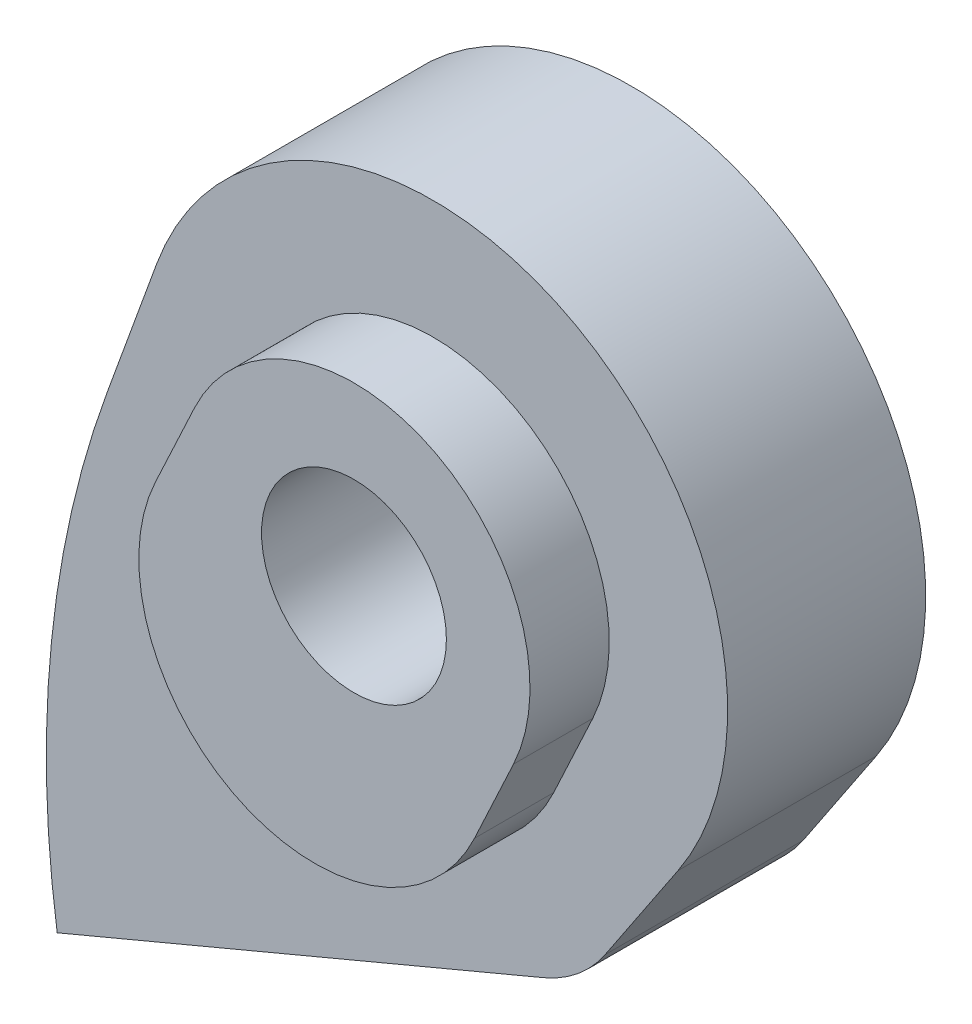
ISO-10303-21;
HEADER;
FILE_DESCRIPTION(('STEP AP214'),'2;1');
FILE_NAME('part.step','',(''),(''),'','','');
FILE_SCHEMA(('AUTOMOTIVE_DESIGN { 1 0 10303 214 1 1 1 1 }'));
ENDSEC;
DATA;
#1=APPLICATION_CONTEXT('core data for automotive mechanical design processes');
#2=APPLICATION_PROTOCOL_DEFINITION('international standard','automotive_design',2000,#1);
#3=PRODUCT_CONTEXT('',#1,'mechanical');
#4=PRODUCT('Part','Part','',(#3));
#5=PRODUCT_RELATED_PRODUCT_CATEGORY('part','',(#4));
#6=PRODUCT_DEFINITION_FORMATION('','',#4);
#7=PRODUCT_DEFINITION_CONTEXT('part definition',#1,'design');
#8=PRODUCT_DEFINITION('design','',#6,#7);
#9=PRODUCT_DEFINITION_SHAPE('','',#8);
#10=(LENGTH_UNIT() NAMED_UNIT(*) SI_UNIT(.MILLI.,.METRE.));
#11=(NAMED_UNIT(*) PLANE_ANGLE_UNIT() SI_UNIT($,.RADIAN.));
#12=(NAMED_UNIT(*) SI_UNIT($,.STERADIAN.) SOLID_ANGLE_UNIT());
#13=UNCERTAINTY_MEASURE_WITH_UNIT(LENGTH_MEASURE(1.E-05),#10,'distance_accuracy_value','');
#14=(GEOMETRIC_REPRESENTATION_CONTEXT(3) GLOBAL_UNCERTAINTY_ASSIGNED_CONTEXT((#13)) GLOBAL_UNIT_ASSIGNED_CONTEXT((#10,
#11,#12)) REPRESENTATION_CONTEXT('',''));
#15=CARTESIAN_POINT('',(0.,0.,0.));
#16=DIRECTION('',(0.,0.,1.));
#17=DIRECTION('',(1.,0.,0.));
#18=AXIS2_PLACEMENT_3D('',#15,#16,#17);
#19=CARTESIAN_POINT('',(0.11468761398859,80.1325343968941,0.));
#20=DIRECTION('',(0.,0.,1.));
#21=DIRECTION('',(1.,0.,0.));
#22=AXIS2_PLACEMENT_3D('',#19,#20,#21);
#23=PLANE('',#22);
#24=CARTESIAN_POINT('',(14.2795120747355,71.4970986035797,0.));
#25=DIRECTION('',(0.,0.,1.));
#26=DIRECTION('',(1.,0.,0.));
#27=AXIS2_PLACEMENT_3D('',#24,#25,#26);
#28=CIRCLE('',#27,22.9540740082007);
#29=CARTESIAN_POINT('',(-7.29026188774433,79.3478542857725,0.));
#30=VERTEX_POINT('',#29);
#31=CARTESIAN_POINT('',(-8.42769677737512,68.1396919078421,0.));
#32=VERTEX_POINT('',#31);
#33=EDGE_CURVE('E154',#30,#32,#28,.T.);
#34=ORIENTED_EDGE('',*,*,#33,.T.);
#35=DIRECTION('',(-0.921960246209325,-0.387284526426812,0.));
#36=VECTOR('',#35,1.);
#37=CARTESIAN_POINT('',(2.62584420432856,72.7829131335289,0.));
#38=LINE('',#37,#36);
#39=CARTESIAN_POINT('',(2.62584420432857,72.7829131335288,0.));
#40=VERTEX_POINT('',#39);
#41=EDGE_CURVE('E178',#40,#32,#38,.T.);
#42=ORIENTED_EDGE('',*,*,#41,.F.);
#43=CARTESIAN_POINT('',(1.41064938117233,75.6757767567832,0.));
#44=DIRECTION('',(0.,0.,-1.));
#45=DIRECTION('',(-1.,0.,0.));
#46=AXIS2_PLACEMENT_3D('',#43,#44,#45);
#47=CIRCLE('',#46,3.13773140994799);
#48=CARTESIAN_POINT('',(4.02035151590427,73.933705240183,0.));
#49=VERTEX_POINT('',#48);
#50=EDGE_CURVE('E173',#49,#40,#47,.T.);
#51=ORIENTED_EDGE('',*,*,#50,.F.);
#52=DIRECTION('',(0.555200968150768,0.831716228628761,0.));
#53=VECTOR('',#52,1.);
#54=CARTESIAN_POINT('',(4.02035151590429,73.933705240183,0.));
#55=LINE('',#54,#53);
#56=CARTESIAN_POINT('',(5.67886918351501,76.4182399199654,0.));
#57=VERTEX_POINT('',#56);
#58=EDGE_CURVE('E147',#49,#57,#55,.T.);
#59=ORIENTED_EDGE('',*,*,#58,.T.);
#60=CARTESIAN_POINT('',(0.11468761398859,80.1325343968941,0.));
#61=DIRECTION('',(0.,0.,1.));
#62=DIRECTION('',(1.,0.,0.));
#63=AXIS2_PLACEMENT_3D('',#60,#61,#62);
#64=CIRCLE('',#63,6.69000000000006);
#65=CARTESIAN_POINT('',(-6.17185601906935,82.4206491557424,0.));
#66=VERTEX_POINT('',#65);
#67=EDGE_CURVE('E149',#57,#66,#64,.T.);
#68=ORIENTED_EDGE('',*,*,#67,.T.);
#69=DIRECTION('',(-0.342020143325666,-0.939692620785909,0.));
#70=VECTOR('',#69,1.);
#71=CARTESIAN_POINT('',(-6.1718560190694,82.4206491557424,0.));
#72=LINE('',#71,#70);
#73=EDGE_CURVE('E155',#66,#30,#72,.T.);
#74=ORIENTED_EDGE('',*,*,#73,.T.);
#75=EDGE_LOOP('',(#34,#42,#51,#59,#68,#74));
#76=FACE_BOUND('',#75,.T.);
#77=DIRECTION('',(-0.4226182617407,-0.90630778703665,0.));
#78=VECTOR('',#77,1.);
#79=CARTESIAN_POINT('',(-3.51054353415801,81.8230074438569,0.));
#80=LINE('',#79,#78);
#81=CARTESIAN_POINT('',(-3.51054353415801,81.8230074438569,0.));
#82=VERTEX_POINT('',#81);
#83=CARTESIAN_POINT('',(-4.39804188381347,79.9197610910799,0.));
#84=VERTEX_POINT('',#83);
#85=EDGE_CURVE('E241',#82,#84,#80,.T.);
#86=ORIENTED_EDGE('',*,*,#85,.F.);
#87=CARTESIAN_POINT('',(0.114687613988609,80.1325343968941,0.));
#88=DIRECTION('',(0.,0.,1.));
#89=DIRECTION('',(1.,0.,0.));
#90=AXIS2_PLACEMENT_3D('',#87,#88,#89);
#91=CIRCLE('',#90,4.00000000000001);
#92=CARTESIAN_POINT('',(3.73991876213519,78.4420613499313,0.));
#93=VERTEX_POINT('',#92);
#94=EDGE_CURVE('E145',#93,#82,#91,.T.);
#95=ORIENTED_EDGE('',*,*,#94,.F.);
#96=DIRECTION('',(0.4226182617407,0.90630778703665,0.));
#97=VECTOR('',#96,1.);
#98=CARTESIAN_POINT('',(3.73991876213519,78.4420613499313,0.));
#99=LINE('',#98,#97);
#100=CARTESIAN_POINT('',(2.85242041247973,76.5388149971543,0.));
#101=VERTEX_POINT('',#100);
#102=EDGE_CURVE('E141',#101,#93,#99,.T.);
#103=ORIENTED_EDGE('',*,*,#102,.F.);
#104=CARTESIAN_POINT('',(-0.772810735666862,78.2292880441171,0.));
#105=DIRECTION('',(0.,0.,1.));
#106=DIRECTION('',(1.,0.,0.));
#107=AXIS2_PLACEMENT_3D('',#104,#105,#106);
#108=CIRCLE('',#107,4.00000000000001);
#109=EDGE_CURVE('E243',#84,#101,#108,.T.);
#110=ORIENTED_EDGE('',*,*,#109,.F.);
#111=EDGE_LOOP('',(#86,#95,#103,#110));
#112=FACE_BOUND('',#111,.T.);
#113=ADVANCED_FACE('F33',(#76,#112),#23,.T.);
#114=CARTESIAN_POINT('',(-8.01359795678153,76.9658058271043,-7.5));
#115=DIRECTION('',(-0.921960246209324,-0.387284526426815,0.));
#116=DIRECTION('',(0.387284526426815,-0.921960246209324,0.));
#117=AXIS2_PLACEMENT_3D('',#114,#115,#116);
#118=PLANE('',#117);
#119=DIRECTION('',(0.387284526426815,-0.921960246209324,0.));
#120=VECTOR('',#119,1.);
#121=CARTESIAN_POINT('',(-8.01359795678153,76.9658058271043,-4.5));
#122=LINE('',#121,#120);
#123=CARTESIAN_POINT('',(-8.01359795678153,76.9658058271043,-4.5));
#124=VERTEX_POINT('',#123);
#125=CARTESIAN_POINT('',(-4.92424784177968,69.611373108264,-4.5));
#126=VERTEX_POINT('',#125);
#127=EDGE_CURVE('E56',#124,#126,#122,.T.);
#128=ORIENTED_EDGE('',*,*,#127,.T.);
#129=DIRECTION('',(0.,0.,1.));
#130=VECTOR('',#129,1.);
#131=CARTESIAN_POINT('',(-4.92424784177968,69.611373108264,-7.5));
#132=LINE('',#131,#130);
#133=CARTESIAN_POINT('',(-4.92424784177968,69.611373108264,-7.5));
#134=VERTEX_POINT('',#133);
#135=EDGE_CURVE('E166',#134,#126,#132,.T.);
#136=ORIENTED_EDGE('',*,*,#135,.F.);
#137=DIRECTION('',(0.387284526426815,-0.921960246209324,0.));
#138=VECTOR('',#137,1.);
#139=CARTESIAN_POINT('',(-8.01359795678153,76.9658058271043,-7.5));
#140=LINE('',#139,#138);
#141=CARTESIAN_POINT('',(-8.01359795678153,76.9658058271043,-7.5));
#142=VERTEX_POINT('',#141);
#143=EDGE_CURVE('E164',#142,#134,#140,.T.);
#144=ORIENTED_EDGE('',*,*,#143,.F.);
#145=DIRECTION('',(0.,0.,1.));
#146=VECTOR('',#145,1.);
#147=CARTESIAN_POINT('',(-8.01359795678153,76.9658058271043,-7.5));
#148=LINE('',#147,#146);
#149=EDGE_CURVE('E170',#142,#124,#148,.T.);
#150=ORIENTED_EDGE('',*,*,#149,.T.);
#151=EDGE_LOOP('',(#128,#136,#144,#150));
#152=FACE_BOUND('',#151,.T.);
#153=ADVANCED_FACE('F230',(#152),#118,.F.);
#154=CARTESIAN_POINT('',(14.2795120747355,71.4970986035797,-7.5));
#155=DIRECTION('',(0.,0.,1.));
#156=DIRECTION('',(1.,0.,0.));
#157=AXIS2_PLACEMENT_3D('',#154,#155,#156);
#158=PLANE('',#157);
#159=DIRECTION('',(-0.921960246209326,-0.38728452642681,0.));
#160=VECTOR('',#159,1.);
#161=CARTESIAN_POINT('',(-4.92424784177968,69.611373108264,-7.5));
#162=LINE('',#161,#160);
#163=CARTESIAN_POINT('',(-8.42769677737511,68.1396919078421,-7.5));
#164=VERTEX_POINT('',#163);
#165=EDGE_CURVE('E159',#134,#164,#162,.T.);
#166=ORIENTED_EDGE('',*,*,#165,.T.);
#167=CARTESIAN_POINT('',(14.2795120747355,71.4970986035797,-7.5));
#168=DIRECTION('',(0.,0.,-1.));
#169=DIRECTION('',(1.,0.,0.));
#170=AXIS2_PLACEMENT_3D('',#167,#168,#169);
#171=CIRCLE('',#170,22.9540740082007);
#172=EDGE_CURVE('E162',#164,#142,#171,.T.);
#173=ORIENTED_EDGE('',*,*,#172,.T.);
#174=ORIENTED_EDGE('',*,*,#143,.T.);
#175=EDGE_LOOP('',(#166,#173,#174));
#176=FACE_BOUND('',#175,.T.);
#177=ADVANCED_FACE('F281',(#176),#158,.F.);
#178=CARTESIAN_POINT('',(0.11468761398859,80.1325343968941,-4.5));
#179=DIRECTION('',(0.,0.,1.));
#180=DIRECTION('',(1.,0.,0.));
#181=AXIS2_PLACEMENT_3D('',#178,#179,#180);
#182=PLANE('',#181);
#183=CARTESIAN_POINT('',(0.11468761398859,80.1325343968941,-4.5));
#184=DIRECTION('',(0.,0.,1.));
#185=DIRECTION('',(1.,0.,0.));
#186=AXIS2_PLACEMENT_3D('',#183,#184,#185);
#187=CIRCLE('',#186,2.10000000000001);
#188=CARTESIAN_POINT('',(2.2146876139886,80.1325343968941,-4.5));
#189=VERTEX_POINT('',#188);
#190=EDGE_CURVE('E246',#189,#189,#187,.T.);
#191=ORIENTED_EDGE('',*,*,#190,.T.);
#192=EDGE_LOOP('',(#191));
#193=FACE_BOUND('',#192,.T.);
#194=ORIENTED_EDGE('',*,*,#127,.F.);
#195=CARTESIAN_POINT('',(14.2795120747355,71.4970986035797,-4.5));
#196=DIRECTION('',(0.,0.,-1.));
#197=DIRECTION('',(-1.,0.,0.));
#198=AXIS2_PLACEMENT_3D('',#195,#196,#197);
#199=CIRCLE('',#198,22.9540740082007);
#200=CARTESIAN_POINT('',(-7.29026188774433,79.3478542857725,-4.5));
#201=VERTEX_POINT('',#200);
#202=EDGE_CURVE('E184',#124,#201,#199,.T.);
#203=ORIENTED_EDGE('',*,*,#202,.T.);
#204=DIRECTION('',(0.342020143325687,0.939692620785902,0.));
#205=VECTOR('',#204,1.);
#206=CARTESIAN_POINT('',(-6.17185601906934,82.4206491557424,-4.5));
#207=LINE('',#206,#205);
#208=CARTESIAN_POINT('',(-6.17185601906934,82.4206491557424,-4.5));
#209=VERTEX_POINT('',#208);
#210=EDGE_CURVE('E186',#201,#209,#207,.T.);
#211=ORIENTED_EDGE('',*,*,#210,.T.);
#212=CARTESIAN_POINT('',(0.11468761398859,80.1325343968941,-4.5));
#213=DIRECTION('',(0.,0.,-1.));
#214=DIRECTION('',(1.,0.,0.));
#215=AXIS2_PLACEMENT_3D('',#212,#213,#214);
#216=CIRCLE('',#215,6.69000000000002);
#217=CARTESIAN_POINT('',(5.67886918351501,76.4182399199654,-4.5));
#218=VERTEX_POINT('',#217);
#219=EDGE_CURVE('E174',#209,#218,#216,.T.);
#220=ORIENTED_EDGE('',*,*,#219,.T.);
#221=DIRECTION('',(-0.555200968150769,-0.83171622862876,0.));
#222=VECTOR('',#221,1.);
#223=CARTESIAN_POINT('',(5.67886918351501,76.4182399199654,-4.5));
#224=LINE('',#223,#222);
#225=CARTESIAN_POINT('',(4.02035151590429,73.933705240183,-4.5));
#226=VERTEX_POINT('',#225);
#227=EDGE_CURVE('E177',#218,#226,#224,.T.);
#228=ORIENTED_EDGE('',*,*,#227,.T.);
#229=CARTESIAN_POINT('',(1.41064938117233,75.6757767567832,-4.5));
#230=DIRECTION('',(0.,0.,-1.));
#231=DIRECTION('',(-1.,0.,0.));
#232=AXIS2_PLACEMENT_3D('',#229,#230,#231);
#233=CIRCLE('',#232,3.13773140994799);
#234=CARTESIAN_POINT('',(2.62584420432857,72.7829131335288,-4.5));
#235=VERTEX_POINT('',#234);
#236=EDGE_CURVE('E180',#226,#235,#233,.T.);
#237=ORIENTED_EDGE('',*,*,#236,.T.);
#238=DIRECTION('',(-0.921960246209325,-0.387284526426812,0.));
#239=VECTOR('',#238,1.);
#240=CARTESIAN_POINT('',(2.62584420432856,72.7829131335289,-4.5));
#241=LINE('',#240,#239);
#242=EDGE_CURVE('E182',#235,#126,#241,.T.);
#243=ORIENTED_EDGE('',*,*,#242,.T.);
#244=EDGE_LOOP('',(#194,#203,#211,#220,#228,#237,#243));
#245=FACE_BOUND('',#244,.T.);
#246=ADVANCED_FACE('F212',(#193,#245),#182,.F.);
#247=CARTESIAN_POINT('',(1.41064938117233,75.6757767567832,-4.5));
#248=DIRECTION('',(0.,0.,1.));
#249=DIRECTION('',(1.,0.,0.));
#250=AXIS2_PLACEMENT_3D('',#247,#248,#249);
#251=CYLINDRICAL_SURFACE('',#250,3.13773140994799);
#252=ORIENTED_EDGE('',*,*,#50,.T.);
#253=DIRECTION('',(0.,0.,1.));
#254=VECTOR('',#253,1.);
#255=CARTESIAN_POINT('',(2.62584420432857,72.7829131335288,-4.5));
#256=LINE('',#255,#254);
#257=EDGE_CURVE('E196',#235,#40,#256,.T.);
#258=ORIENTED_EDGE('',*,*,#257,.F.);
#259=ORIENTED_EDGE('',*,*,#236,.F.);
#260=DIRECTION('',(0.,0.,1.));
#261=VECTOR('',#260,1.);
#262=CARTESIAN_POINT('',(4.02035151590429,73.933705240183,-4.5));
#263=LINE('',#262,#261);
#264=EDGE_CURVE('E199',#226,#49,#263,.T.);
#265=ORIENTED_EDGE('',*,*,#264,.T.);
#266=EDGE_LOOP('',(#252,#258,#259,#265));
#267=FACE_BOUND('',#266,.T.);
#268=ADVANCED_FACE('F223',(#267),#251,.T.);
#269=CARTESIAN_POINT('',(2.62584420432856,72.7829131335289,-4.5));
#270=DIRECTION('',(-0.387284526426812,0.921960246209325,0.));
#271=DIRECTION('',(-0.921960246209325,-0.387284526426812,0.));
#272=AXIS2_PLACEMENT_3D('',#269,#270,#271);
#273=PLANE('',#272);
#274=ORIENTED_EDGE('',*,*,#41,.T.);
#275=DIRECTION('',(0.,0.,1.));
#276=VECTOR('',#275,1.);
#277=CARTESIAN_POINT('',(-8.42769677737511,68.1396919078421,-4.5));
#278=LINE('',#277,#276);
#279=EDGE_CURVE('E189',#164,#32,#278,.T.);
#280=ORIENTED_EDGE('',*,*,#279,.F.);
#281=ORIENTED_EDGE('',*,*,#165,.F.);
#282=ORIENTED_EDGE('',*,*,#135,.T.);
#283=ORIENTED_EDGE('',*,*,#242,.F.);
#284=ORIENTED_EDGE('',*,*,#257,.T.);
#285=EDGE_LOOP('',(#274,#280,#281,#282,#283,#284));
#286=FACE_BOUND('',#285,.T.);
#287=ADVANCED_FACE('F225',(#286),#273,.F.);
#288=CARTESIAN_POINT('',(14.2795120747355,71.4970986035797,11.));
#289=DIRECTION('',(0.,0.,-1.));
#290=DIRECTION('',(-1.,0.,0.));
#291=AXIS2_PLACEMENT_3D('',#288,#289,#290);
#292=CYLINDRICAL_SURFACE('',#291,22.9540740082007);
#293=ORIENTED_EDGE('',*,*,#33,.F.);
#294=DIRECTION('',(0.,0.,-1.));
#295=VECTOR('',#294,1.);
#296=CARTESIAN_POINT('',(-7.29026188774433,79.3478542857725,11.));
#297=LINE('',#296,#295);
#298=EDGE_CURVE('E202',#30,#201,#297,.T.);
#299=ORIENTED_EDGE('',*,*,#298,.T.);
#300=ORIENTED_EDGE('',*,*,#202,.F.);
#301=ORIENTED_EDGE('',*,*,#149,.F.);
#302=ORIENTED_EDGE('',*,*,#172,.F.);
#303=ORIENTED_EDGE('',*,*,#279,.T.);
#304=EDGE_LOOP('',(#293,#299,#300,#301,#302,#303));
#305=FACE_BOUND('',#304,.T.);
#306=ADVANCED_FACE('F235',(#305),#292,.T.);
#307=CARTESIAN_POINT('',(-6.1718560190694,82.4206491557424,11.));
#308=DIRECTION('',(0.939692620785909,-0.342020143325666,0.));
#309=DIRECTION('',(0.342020143325666,0.939692620785909,0.));
#310=AXIS2_PLACEMENT_3D('',#307,#308,#309);
#311=PLANE('',#310);
#312=ORIENTED_EDGE('',*,*,#73,.F.);
#313=DIRECTION('',(0.,0.,-1.));
#314=VECTOR('',#313,1.);
#315=CARTESIAN_POINT('',(-6.17185601906935,82.4206491557424,11.));
#316=LINE('',#315,#314);
#317=EDGE_CURVE('E41',#66,#209,#316,.T.);
#318=ORIENTED_EDGE('',*,*,#317,.T.);
#319=ORIENTED_EDGE('',*,*,#210,.F.);
#320=ORIENTED_EDGE('',*,*,#298,.F.);
#321=EDGE_LOOP('',(#312,#318,#319,#320));
#322=FACE_BOUND('',#321,.T.);
#323=ADVANCED_FACE('F207',(#322),#311,.F.);
#324=CARTESIAN_POINT('',(0.11468761398859,80.1325343968941,11.));
#325=DIRECTION('',(0.,0.,-1.));
#326=DIRECTION('',(-1.,0.,0.));
#327=AXIS2_PLACEMENT_3D('',#324,#325,#326);
#328=CYLINDRICAL_SURFACE('',#327,6.69000000000006);
#329=ORIENTED_EDGE('',*,*,#317,.F.);
#330=ORIENTED_EDGE('',*,*,#67,.F.);
#331=DIRECTION('',(0.,0.,-1.));
#332=VECTOR('',#331,1.);
#333=CARTESIAN_POINT('',(5.67886918351501,76.4182399199654,11.));
#334=LINE('',#333,#332);
#335=EDGE_CURVE('E11',#57,#218,#334,.T.);
#336=ORIENTED_EDGE('',*,*,#335,.T.);
#337=ORIENTED_EDGE('',*,*,#219,.F.);
#338=EDGE_LOOP('',(#329,#330,#336,#337));
#339=FACE_BOUND('',#338,.T.);
#340=ADVANCED_FACE('F213',(#339),#328,.T.);
#341=CARTESIAN_POINT('',(4.02035151590429,73.933705240183,11.));
#342=DIRECTION('',(-0.831716228628761,0.555200968150768,0.));
#343=DIRECTION('',(-0.555200968150768,-0.831716228628761,0.));
#344=AXIS2_PLACEMENT_3D('',#341,#342,#343);
#345=PLANE('',#344);
#346=ORIENTED_EDGE('',*,*,#58,.F.);
#347=ORIENTED_EDGE('',*,*,#264,.F.);
#348=ORIENTED_EDGE('',*,*,#227,.F.);
#349=ORIENTED_EDGE('',*,*,#335,.F.);
#350=EDGE_LOOP('',(#346,#347,#348,#349));
#351=FACE_BOUND('',#350,.T.);
#352=ADVANCED_FACE('F35',(#351),#345,.F.);
#353=CARTESIAN_POINT('',(0.114687613988609,80.1325343968941,1.8));
#354=DIRECTION('',(0.,0.,-1.));
#355=DIRECTION('',(-1.,0.,0.));
#356=AXIS2_PLACEMENT_3D('',#353,#354,#355);
#357=CYLINDRICAL_SURFACE('',#356,4.00000000000001);
#358=ORIENTED_EDGE('',*,*,#94,.T.);
#359=DIRECTION('',(0.,0.,-1.));
#360=VECTOR('',#359,1.);
#361=CARTESIAN_POINT('',(-3.51054353415801,81.8230074438569,1.8));
#362=LINE('',#361,#360);
#363=CARTESIAN_POINT('',(-3.51054353415801,81.8230074438569,1.8));
#364=VERTEX_POINT('',#363);
#365=EDGE_CURVE('E126',#364,#82,#362,.T.);
#366=ORIENTED_EDGE('',*,*,#365,.F.);
#367=CARTESIAN_POINT('',(0.114687613988609,80.1325343968941,1.8));
#368=DIRECTION('',(0.,0.,1.));
#369=DIRECTION('',(1.,0.,0.));
#370=AXIS2_PLACEMENT_3D('',#367,#368,#369);
#371=CIRCLE('',#370,4.00000000000001);
#372=CARTESIAN_POINT('',(3.73991876213519,78.4420613499313,1.8));
#373=VERTEX_POINT('',#372);
#374=EDGE_CURVE('E133',#373,#364,#371,.T.);
#375=ORIENTED_EDGE('',*,*,#374,.F.);
#376=DIRECTION('',(0.,0.,-1.));
#377=VECTOR('',#376,1.);
#378=CARTESIAN_POINT('',(3.73991876213519,78.4420613499313,1.8));
#379=LINE('',#378,#377);
#380=EDGE_CURVE('E251',#373,#93,#379,.T.);
#381=ORIENTED_EDGE('',*,*,#380,.T.);
#382=EDGE_LOOP('',(#358,#366,#375,#381));
#383=FACE_BOUND('',#382,.T.);
#384=ADVANCED_FACE('F143',(#383),#357,.T.);
#385=CARTESIAN_POINT('',(-3.51054353415801,81.8230074438569,1.8));
#386=DIRECTION('',(0.90630778703665,-0.4226182617407,0.));
#387=DIRECTION('',(0.4226182617407,0.90630778703665,0.));
#388=AXIS2_PLACEMENT_3D('',#385,#386,#387);
#389=PLANE('',#388);
#390=ORIENTED_EDGE('',*,*,#85,.T.);
#391=DIRECTION('',(0.,0.,-1.));
#392=VECTOR('',#391,1.);
#393=CARTESIAN_POINT('',(-4.39804188381347,79.9197610910799,1.8));
#394=LINE('',#393,#392);
#395=CARTESIAN_POINT('',(-4.39804188381347,79.9197610910799,1.8));
#396=VERTEX_POINT('',#395);
#397=EDGE_CURVE('E129',#396,#84,#394,.T.);
#398=ORIENTED_EDGE('',*,*,#397,.F.);
#399=DIRECTION('',(-0.4226182617407,-0.90630778703665,0.));
#400=VECTOR('',#399,1.);
#401=CARTESIAN_POINT('',(-3.51054353415801,81.8230074438569,1.8));
#402=LINE('',#401,#400);
#403=EDGE_CURVE('E122',#364,#396,#402,.T.);
#404=ORIENTED_EDGE('',*,*,#403,.F.);
#405=ORIENTED_EDGE('',*,*,#365,.T.);
#406=EDGE_LOOP('',(#390,#398,#404,#405));
#407=FACE_BOUND('',#406,.T.);
#408=ADVANCED_FACE('F124',(#407),#389,.F.);
#409=CARTESIAN_POINT('',(-0.772810735666862,78.2292880441171,1.8));
#410=DIRECTION('',(0.,0.,-1.));
#411=DIRECTION('',(-1.,0.,0.));
#412=AXIS2_PLACEMENT_3D('',#409,#410,#411);
#413=CYLINDRICAL_SURFACE('',#412,4.00000000000001);
#414=ORIENTED_EDGE('',*,*,#109,.T.);
#415=DIRECTION('',(0.,0.,-1.));
#416=VECTOR('',#415,1.);
#417=CARTESIAN_POINT('',(2.85242041247973,76.5388149971543,1.8));
#418=LINE('',#417,#416);
#419=CARTESIAN_POINT('',(2.85242041247973,76.5388149971543,1.8));
#420=VERTEX_POINT('',#419);
#421=EDGE_CURVE('E48',#420,#101,#418,.T.);
#422=ORIENTED_EDGE('',*,*,#421,.F.);
#423=CARTESIAN_POINT('',(-0.772810735666862,78.2292880441171,1.8));
#424=DIRECTION('',(0.,0.,1.));
#425=DIRECTION('',(1.,0.,0.));
#426=AXIS2_PLACEMENT_3D('',#423,#424,#425);
#427=CIRCLE('',#426,4.00000000000001);
#428=EDGE_CURVE('E132',#396,#420,#427,.T.);
#429=ORIENTED_EDGE('',*,*,#428,.F.);
#430=ORIENTED_EDGE('',*,*,#397,.T.);
#431=EDGE_LOOP('',(#414,#422,#429,#430));
#432=FACE_BOUND('',#431,.T.);
#433=ADVANCED_FACE('F271',(#432),#413,.T.);
#434=CARTESIAN_POINT('',(3.73991876213519,78.4420613499313,1.8));
#435=DIRECTION('',(-0.90630778703665,0.4226182617407,0.));
#436=DIRECTION('',(-0.4226182617407,-0.90630778703665,0.));
#437=AXIS2_PLACEMENT_3D('',#434,#435,#436);
#438=PLANE('',#437);
#439=ORIENTED_EDGE('',*,*,#102,.T.);
#440=ORIENTED_EDGE('',*,*,#380,.F.);
#441=DIRECTION('',(0.4226182617407,0.90630778703665,0.));
#442=VECTOR('',#441,1.);
#443=CARTESIAN_POINT('',(3.73991876213519,78.4420613499313,1.8));
#444=LINE('',#443,#442);
#445=EDGE_CURVE('E137',#420,#373,#444,.T.);
#446=ORIENTED_EDGE('',*,*,#445,.F.);
#447=ORIENTED_EDGE('',*,*,#421,.T.);
#448=EDGE_LOOP('',(#439,#440,#446,#447));
#449=FACE_BOUND('',#448,.T.);
#450=ADVANCED_FACE('F264',(#449),#438,.F.);
#451=CARTESIAN_POINT('',(0.114687613988609,80.1325343968941,1.8));
#452=DIRECTION('',(0.,0.,1.));
#453=DIRECTION('',(1.,0.,0.));
#454=AXIS2_PLACEMENT_3D('',#451,#452,#453);
#455=PLANE('',#454);
#456=CARTESIAN_POINT('',(0.11468761398859,80.1325343968941,1.8));
#457=DIRECTION('',(0.,0.,1.));
#458=DIRECTION('',(1.,0.,0.));
#459=AXIS2_PLACEMENT_3D('',#456,#457,#458);
#460=CIRCLE('',#459,2.10000000000001);
#461=CARTESIAN_POINT('',(2.2146876139886,80.1325343968941,1.8));
#462=VERTEX_POINT('',#461);
#463=EDGE_CURVE('E256',#462,#462,#460,.T.);
#464=ORIENTED_EDGE('',*,*,#463,.F.);
#465=EDGE_LOOP('',(#464));
#466=FACE_BOUND('',#465,.T.);
#467=ORIENTED_EDGE('',*,*,#374,.T.);
#468=ORIENTED_EDGE('',*,*,#403,.T.);
#469=ORIENTED_EDGE('',*,*,#428,.T.);
#470=ORIENTED_EDGE('',*,*,#445,.T.);
#471=EDGE_LOOP('',(#467,#468,#469,#470));
#472=FACE_BOUND('',#471,.T.);
#473=ADVANCED_FACE('F136',(#466,#472),#455,.T.);
#474=CARTESIAN_POINT('',(0.11468761398859,80.1325343968941,-7.5));
#475=DIRECTION('',(0.,0.,1.));
#476=DIRECTION('',(1.,0.,0.));
#477=AXIS2_PLACEMENT_3D('',#474,#475,#476);
#478=CYLINDRICAL_SURFACE('',#477,2.10000000000001);
#479=ORIENTED_EDGE('',*,*,#463,.T.);
#480=EDGE_LOOP('',(#479));
#481=FACE_BOUND('',#480,.T.);
#482=ORIENTED_EDGE('',*,*,#190,.F.);
#483=EDGE_LOOP('',(#482));
#484=FACE_BOUND('',#483,.T.);
#485=ADVANCED_FACE('F260',(#481,#484),#478,.F.);
#486=CLOSED_SHELL('',(#113,#153,#177,#246,#268,#287,#306,#323,#340,#352,#384,#408,#433,#450,
#473,#485));
#487=MANIFOLD_SOLID_BREP('B2',#486);
#488=ADVANCED_BREP_SHAPE_REPRESENTATION('',(#18,#487),#14);
#489=SHAPE_DEFINITION_REPRESENTATION(#9,#488);
ENDSEC;
END-ISO-10303-21;
